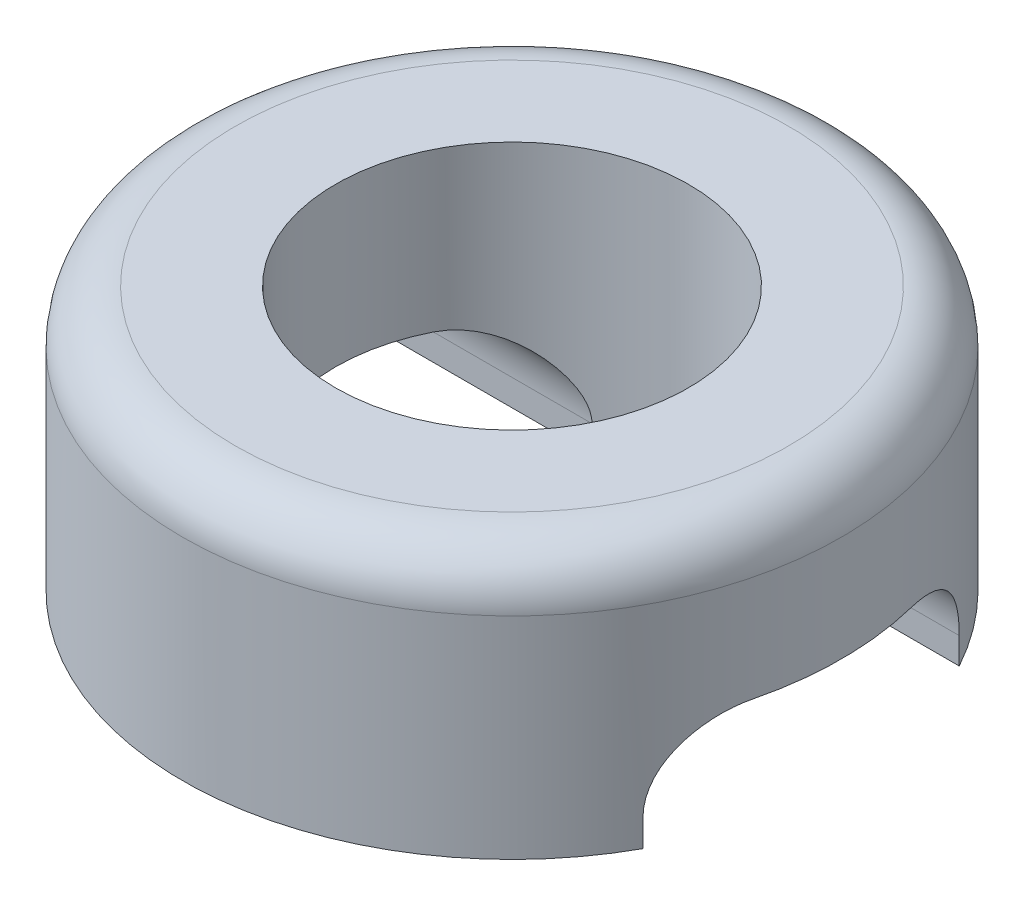
ISO-10303-21;
HEADER;
FILE_DESCRIPTION(('STEP AP214'),'2;1');
FILE_NAME('part.step','',(''),(''),'','','');
FILE_SCHEMA(('AUTOMOTIVE_DESIGN { 1 0 10303 214 1 1 1 1 }'));
ENDSEC;
DATA;
#1=APPLICATION_CONTEXT('core data for automotive mechanical design processes');
#2=APPLICATION_PROTOCOL_DEFINITION('international standard','automotive_design',2000,#1);
#3=PRODUCT_CONTEXT('',#1,'mechanical');
#4=PRODUCT('Part','Part','',(#3));
#5=PRODUCT_RELATED_PRODUCT_CATEGORY('part','',(#4));
#6=PRODUCT_DEFINITION_FORMATION('','',#4);
#7=PRODUCT_DEFINITION_CONTEXT('part definition',#1,'design');
#8=PRODUCT_DEFINITION('design','',#6,#7);
#9=PRODUCT_DEFINITION_SHAPE('','',#8);
#10=(LENGTH_UNIT() NAMED_UNIT(*) SI_UNIT(.MILLI.,.METRE.));
#11=(NAMED_UNIT(*) PLANE_ANGLE_UNIT() SI_UNIT($,.RADIAN.));
#12=(NAMED_UNIT(*) SI_UNIT($,.STERADIAN.) SOLID_ANGLE_UNIT());
#13=UNCERTAINTY_MEASURE_WITH_UNIT(LENGTH_MEASURE(1.E-05),#10,'distance_accuracy_value','');
#14=(GEOMETRIC_REPRESENTATION_CONTEXT(3) GLOBAL_UNCERTAINTY_ASSIGNED_CONTEXT((#13)) GLOBAL_UNIT_ASSIGNED_CONTEXT((#10,
#11,#12)) REPRESENTATION_CONTEXT('',''));
#15=CARTESIAN_POINT('',(0.,0.,0.));
#16=DIRECTION('',(0.,0.,1.));
#17=DIRECTION('',(1.,0.,0.));
#18=AXIS2_PLACEMENT_3D('',#15,#16,#17);
#19=CARTESIAN_POINT('',(0.,0.,0.));
#20=DIRECTION('',(0.,1.,0.));
#21=DIRECTION('',(0.,0.,1.));
#22=AXIS2_PLACEMENT_3D('',#19,#20,#21);
#23=PLANE('',#22);
#24=CARTESIAN_POINT('',(0.,0.,0.));
#25=DIRECTION('',(0.,1.,0.));
#26=DIRECTION('',(0.,0.,1.));
#27=AXIS2_PLACEMENT_3D('',#24,#25,#26);
#28=CIRCLE('',#27,7.9375);
#29=CARTESIAN_POINT('',(-6.96331862332897,0.,3.81));
#30=VERTEX_POINT('',#29);
#31=CARTESIAN_POINT('',(6.96331862332897,0.,3.81));
#32=VERTEX_POINT('',#31);
#33=EDGE_CURVE('E152',#30,#32,#28,.T.);
#34=ORIENTED_EDGE('',*,*,#33,.F.);
#35=DIRECTION('',(1.,0.,0.));
#36=VECTOR('',#35,1.);
#37=CARTESIAN_POINT('',(-7.9375,0.,3.81));
#38=LINE('',#37,#36);
#39=CARTESIAN_POINT('',(-1.88318878501334,0.,3.81));
#40=VERTEX_POINT('',#39);
#41=EDGE_CURVE('E278',#30,#40,#38,.T.);
#42=ORIENTED_EDGE('',*,*,#41,.T.);
#43=CARTESIAN_POINT('',(0.,0.,0.));
#44=DIRECTION('',(0.,1.,0.));
#45=DIRECTION('',(0.,0.,1.));
#46=AXIS2_PLACEMENT_3D('',#43,#44,#45);
#47=CIRCLE('',#46,4.25);
#48=CARTESIAN_POINT('',(1.88318878501334,0.,3.81));
#49=VERTEX_POINT('',#48);
#50=EDGE_CURVE('E158',#40,#49,#47,.T.);
#51=ORIENTED_EDGE('',*,*,#50,.T.);
#52=EDGE_CURVE('E280',#49,#32,#38,.T.);
#53=ORIENTED_EDGE('',*,*,#52,.T.);
#54=EDGE_LOOP('',(#34,#42,#51,#53));
#55=FACE_BOUND('',#54,.T.);
#56=ADVANCED_FACE('F35',(#55),#23,.F.);
#57=CARTESIAN_POINT('',(0.,6.35,0.));
#58=DIRECTION('',(0.,1.,0.));
#59=DIRECTION('',(0.,0.,1.));
#60=AXIS2_PLACEMENT_3D('',#57,#58,#59);
#61=PLANE('',#60);
#62=CARTESIAN_POINT('',(0.,6.35,0.));
#63=DIRECTION('',(0.,1.,0.));
#64=DIRECTION('',(0.,0.,1.));
#65=AXIS2_PLACEMENT_3D('',#62,#63,#64);
#66=CIRCLE('',#65,6.6675);
#67=CARTESIAN_POINT('',(0.,6.35,6.6675));
#68=VERTEX_POINT('',#67);
#69=EDGE_CURVE('E43',#68,#68,#66,.T.);
#70=ORIENTED_EDGE('',*,*,#69,.T.);
#71=EDGE_LOOP('',(#70));
#72=FACE_BOUND('',#71,.T.);
#73=CARTESIAN_POINT('',(0.,6.35,0.));
#74=DIRECTION('',(0.,1.,0.));
#75=DIRECTION('',(0.,0.,1.));
#76=AXIS2_PLACEMENT_3D('',#73,#74,#75);
#77=CIRCLE('',#76,4.25);
#78=CARTESIAN_POINT('',(0.,6.35,4.25));
#79=VERTEX_POINT('',#78);
#80=EDGE_CURVE('E156',#79,#79,#77,.T.);
#81=ORIENTED_EDGE('',*,*,#80,.F.);
#82=EDGE_LOOP('',(#81));
#83=FACE_BOUND('',#82,.T.);
#84=ADVANCED_FACE('F258',(#72,#83),#61,.T.);
#85=CARTESIAN_POINT('',(6.96331862332897,0.,-3.81));
#86=VERTEX_POINT('',#85);
#87=CARTESIAN_POINT('',(-6.96331862332897,0.,-3.81));
#88=VERTEX_POINT('',#87);
#89=EDGE_CURVE('E142',#86,#88,#28,.T.);
#90=ORIENTED_EDGE('',*,*,#89,.F.);
#91=DIRECTION('',(1.,0.,0.));
#92=VECTOR('',#91,1.);
#93=CARTESIAN_POINT('',(-7.9375,0.,-3.81));
#94=LINE('',#93,#92);
#95=CARTESIAN_POINT('',(1.88318878501334,0.,-3.81));
#96=VERTEX_POINT('',#95);
#97=EDGE_CURVE('E145',#96,#86,#94,.T.);
#98=ORIENTED_EDGE('',*,*,#97,.F.);
#99=CARTESIAN_POINT('',(-1.88318878501334,0.,-3.81));
#100=VERTEX_POINT('',#99);
#101=EDGE_CURVE('E144',#96,#100,#47,.T.);
#102=ORIENTED_EDGE('',*,*,#101,.T.);
#103=EDGE_CURVE('E129',#88,#100,#94,.T.);
#104=ORIENTED_EDGE('',*,*,#103,.F.);
#105=EDGE_LOOP('',(#90,#98,#102,#104));
#106=FACE_BOUND('',#105,.T.);
#107=ADVANCED_FACE('F140',(#106),#23,.F.);
#108=CARTESIAN_POINT('',(0.,6.35,0.));
#109=DIRECTION('',(0.,-1.,0.));
#110=DIRECTION('',(0.,0.,-1.));
#111=AXIS2_PLACEMENT_3D('',#108,#109,#110);
#112=CYLINDRICAL_SURFACE('',#111,7.9375);
#113=CARTESIAN_POINT('',(0.,5.08,0.));
#114=DIRECTION('',(0.,1.,0.));
#115=DIRECTION('',(0.,0.,1.));
#116=AXIS2_PLACEMENT_3D('',#113,#114,#115);
#117=CIRCLE('',#116,7.9375);
#118=CARTESIAN_POINT('',(0.,5.08,7.9375));
#119=VERTEX_POINT('',#118);
#120=EDGE_CURVE('E11',#119,#119,#117,.F.);
#121=ORIENTED_EDGE('',*,*,#120,.T.);
#122=EDGE_LOOP('',(#121));
#123=FACE_BOUND('',#122,.T.);
#124=ORIENTED_EDGE('',*,*,#33,.T.);
#125=DIRECTION('',(0.,-1.,0.));
#126=VECTOR('',#125,1.);
#127=CARTESIAN_POINT('',(6.96331862332897,6.35,3.81));
#128=LINE('',#127,#126);
#129=CARTESIAN_POINT('',(6.96331862332897,0.635,3.81));
#130=VERTEX_POINT('',#129);
#131=EDGE_CURVE('E282',#32,#130,#128,.F.);
#132=ORIENTED_EDGE('',*,*,#131,.T.);
#133=CARTESIAN_POINT('',(6.96331862332897,0.635,3.81));
#134=CARTESIAN_POINT('',(6.96330971734871,0.684571337621361,3.8100083999307));
#135=CARTESIAN_POINT('',(6.96437707471063,0.734136683480784,3.8080653495333));
#136=CARTESIAN_POINT('',(6.96859712753622,0.83285719490267,3.80034150649958));
#137=CARTESIAN_POINT('',(6.97174891950333,0.882012528840981,3.79456237660491));
#138=CARTESIAN_POINT('',(6.98005087105731,0.979325280765483,3.77926807086319));
#139=CARTESIAN_POINT('',(6.98519140635103,1.02748634569067,3.76977088551387));
#140=CARTESIAN_POINT('',(6.99734438606697,1.12270109807122,3.74716451509793));
#141=CARTESIAN_POINT('',(7.00435696004143,1.16975470864117,3.73405508004777));
#142=CARTESIAN_POINT('',(7.02796000436399,1.30865266000526,3.68955565232242));
#143=CARTESIAN_POINT('',(7.04713557627256,1.39845407178734,3.65295924328777));
#144=CARTESIAN_POINT('',(7.09088746940067,1.57046709469664,3.56728516619077));
#145=CARTESIAN_POINT('',(7.11546968308542,1.65267028493978,3.51819387124215));
#146=CARTESIAN_POINT('',(7.17011544831952,1.81300152221234,3.40551152098712));
#147=CARTESIAN_POINT('',(7.20042880327215,1.89053401138598,3.34119466138171));
#148=CARTESIAN_POINT('',(7.26349231070216,2.03406772974483,3.20178715463066));
#149=CARTESIAN_POINT('',(7.29624357611327,2.10006364574892,3.12669157217464));
#150=CARTESIAN_POINT('',(7.36590090773889,2.22556095105073,2.95912959654468));
#151=CARTESIAN_POINT('',(7.40288800706839,2.28369750000547,2.86567110440167));
#152=CARTESIAN_POINT('',(7.47574256606658,2.38316606975702,2.66984849917663));
#153=CARTESIAN_POINT('',(7.5116105832171,2.42450658516905,2.56748891971217));
#154=CARTESIAN_POINT('',(7.57519856041543,2.48408822819273,2.37256400229565));
#155=CARTESIAN_POINT('',(7.60332332606109,2.50490389467853,2.28091302499706));
#156=CARTESIAN_POINT('',(7.6567453835679,2.53287925359981,2.0946930168271));
#157=CARTESIAN_POINT('',(7.6820408210699,2.54003003879286,2.00012212343029));
#158=CARTESIAN_POINT('',(7.70550979818986,2.54,1.905));
#159=B_SPLINE_CURVE_WITH_KNOTS('',3,(#133,#134,#135,#136,#137,#138,#139,#140,#141,#142,#143,
#144,#145,#146,#147,#148,#149,#150,#151,#152,#153,#154,#155,#156,#157,#158),.UNSPECIFIED.,.F.,
.F.,(4,2,2,2,2,2,2,2,2,2,2,2,4),(0.,0.148654528629517,0.297244665263553,0.445124535000367,
0.593014641244911,0.888132433579724,1.18357347003446,1.49788312274621,1.81233715189798,
2.1591134301795,2.50571410694372,2.79901628553772,3.09250958351312),.UNSPECIFIED.);
#160=CARTESIAN_POINT('',(7.70550979818986,2.54,1.905));
#161=VERTEX_POINT('',#160);
#162=EDGE_CURVE('E233',#130,#161,#159,.T.);
#163=ORIENTED_EDGE('',*,*,#162,.T.);
#164=CARTESIAN_POINT('',(0.,2.54,0.));
#165=DIRECTION('',(0.,1.,0.));
#166=DIRECTION('',(0.,0.,1.));
#167=AXIS2_PLACEMENT_3D('',#164,#165,#166);
#168=CIRCLE('',#167,7.9375);
#169=CARTESIAN_POINT('',(7.70550979818986,2.54,-1.905));
#170=VERTEX_POINT('',#169);
#171=EDGE_CURVE('E292',#161,#170,#168,.T.);
#172=ORIENTED_EDGE('',*,*,#171,.T.);
#173=CARTESIAN_POINT('',(7.70550979818986,2.54,-1.905));
#174=CARTESIAN_POINT('',(7.69168912501219,2.53999973121714,-1.96091803105047));
#175=CARTESIAN_POINT('',(7.67726031554106,2.53753694694524,-2.01665054421886));
#176=CARTESIAN_POINT('',(7.64731669586853,2.52779249692022,-2.12737701700698));
#177=CARTESIAN_POINT('',(7.6318022858931,2.52051259879874,-2.18237123999136));
#178=CARTESIAN_POINT('',(7.58391087865882,2.49166435254407,-2.34541359404266));
#179=CARTESIAN_POINT('',(7.55009697402387,2.46308603071164,-2.4518783118832));
#180=CARTESIAN_POINT('',(7.48020559819006,2.38849822452339,-2.6574885301585));
#181=CARTESIAN_POINT('',(7.4441304183731,2.34250615490643,-2.75664122505883));
#182=CARTESIAN_POINT('',(7.37140432478056,2.23438408451349,-2.94560002615675));
#183=CARTESIAN_POINT('',(7.33475300728835,2.17224224594768,-3.0353992083047));
#184=CARTESIAN_POINT('',(7.2617075622229,2.03082589075286,-3.2063132131265));
#185=CARTESIAN_POINT('',(7.22536467022754,1.95104012585804,-3.28702830257871));
#186=CARTESIAN_POINT('',(7.15680743082065,1.77731653258336,-3.43374179137968));
#187=CARTESIAN_POINT('',(7.12459308573784,1.683378696221,-3.49974018242743));
#188=CARTESIAN_POINT('',(7.0681020828453,1.48708354494609,-3.61243479489868));
#189=CARTESIAN_POINT('',(7.04358449041438,1.38514282569587,-3.65973240890417));
#190=CARTESIAN_POINT('',(7.00349551239241,1.17305071693939,-3.73588576787916));
#191=CARTESIAN_POINT('',(6.98790237579539,1.0629200357042,-3.76478637018952));
#192=CARTESIAN_POINT('',(6.97292621634711,0.898726630389736,-3.79239920352652));
#193=CARTESIAN_POINT('',(6.96933445786319,0.846256424161746,-3.79898931205036));
#194=CARTESIAN_POINT('',(6.96452852048648,0.740869497898738,-3.80778973771252));
#195=CARTESIAN_POINT('',(6.96331313789491,0.687953017562957,-3.81000227221742));
#196=CARTESIAN_POINT('',(6.96331862332897,0.635000000000001,-3.81));
#197=B_SPLINE_CURVE_WITH_KNOTS('',3,(#173,#174,#175,#176,#177,#178,#179,#180,#181,#182,#183,
#184,#185,#186,#187,#188,#189,#190,#191,#192,#193,#194,#195,#196),.UNSPECIFIED.,.F.,.F.,(4,2,2,
2,2,2,2,2,2,2,2,4),(0.,0.172682169402191,0.345301008493322,0.689449970084579,1.03325566830264,
1.37731409058996,1.73308578148972,2.0888576730637,2.43201572333951,2.77433381530749,
2.93314269462705,3.09187111208691),.UNSPECIFIED.);
#198=CARTESIAN_POINT('',(6.96331862332897,0.635000000000001,-3.81));
#199=VERTEX_POINT('',#198);
#200=EDGE_CURVE('E189',#170,#199,#197,.T.);
#201=ORIENTED_EDGE('',*,*,#200,.T.);
#202=DIRECTION('',(0.,-1.,0.));
#203=VECTOR('',#202,1.);
#204=CARTESIAN_POINT('',(6.96331862332897,6.35,-3.81));
#205=LINE('',#204,#203);
#206=EDGE_CURVE('E135',#199,#86,#205,.T.);
#207=ORIENTED_EDGE('',*,*,#206,.T.);
#208=ORIENTED_EDGE('',*,*,#89,.T.);
#209=DIRECTION('',(0.,-1.,0.));
#210=VECTOR('',#209,1.);
#211=CARTESIAN_POINT('',(-6.96331862332897,6.35,-3.81));
#212=LINE('',#211,#210);
#213=CARTESIAN_POINT('',(-6.96331862332897,0.635000000000001,-3.81));
#214=VERTEX_POINT('',#213);
#215=EDGE_CURVE('E125',#88,#214,#212,.F.);
#216=ORIENTED_EDGE('',*,*,#215,.T.);
#217=CARTESIAN_POINT('',(-6.96331862332897,0.635000000000001,-3.81));
#218=CARTESIAN_POINT('',(-6.96330971734871,0.684571337621362,-3.8100083999307));
#219=CARTESIAN_POINT('',(-6.96437707471063,0.734136683480785,-3.8080653495333));
#220=CARTESIAN_POINT('',(-6.96859712753622,0.832857194902671,-3.80034150649958));
#221=CARTESIAN_POINT('',(-6.97174891950333,0.882012528840982,-3.79456237660491));
#222=CARTESIAN_POINT('',(-6.98005087105731,0.979325280765484,-3.77926807086319));
#223=CARTESIAN_POINT('',(-6.98519140635103,1.02748634569067,-3.76977088551387));
#224=CARTESIAN_POINT('',(-6.99734438606697,1.12270109807122,-3.74716451509793));
#225=CARTESIAN_POINT('',(-7.00435696004143,1.16975470864117,-3.73405508004777));
#226=CARTESIAN_POINT('',(-7.02796000436399,1.30865266000526,-3.68955565232242));
#227=CARTESIAN_POINT('',(-7.04713557627256,1.39845407178734,-3.65295924328777));
#228=CARTESIAN_POINT('',(-7.09088746940067,1.57046709469664,-3.56728516619077));
#229=CARTESIAN_POINT('',(-7.11546968308543,1.65267028493978,-3.51819387124215));
#230=CARTESIAN_POINT('',(-7.17011544831952,1.81300152221234,-3.40551152098712));
#231=CARTESIAN_POINT('',(-7.20042880327215,1.89053401138599,-3.34119466138171));
#232=CARTESIAN_POINT('',(-7.26349231070216,2.03406772974483,-3.20178715463066));
#233=CARTESIAN_POINT('',(-7.29624357611327,2.10006364574892,-3.12669157217464));
#234=CARTESIAN_POINT('',(-7.36590090773889,2.22556095105073,-2.95912959654468));
#235=CARTESIAN_POINT('',(-7.40288800706838,2.28369750000547,-2.86567110440167));
#236=CARTESIAN_POINT('',(-7.47574256606658,2.38316606975702,-2.66984849917663));
#237=CARTESIAN_POINT('',(-7.5116105832171,2.42450658516905,-2.56748891971217));
#238=CARTESIAN_POINT('',(-7.57519856041543,2.48408822819273,-2.37256400229565));
#239=CARTESIAN_POINT('',(-7.60332332606109,2.50490389467853,-2.28091302499706));
#240=CARTESIAN_POINT('',(-7.6567453835679,2.53287925359981,-2.09469301682709));
#241=CARTESIAN_POINT('',(-7.6820408210699,2.54003003879286,-2.00012212343028));
#242=CARTESIAN_POINT('',(-7.70550979818986,2.54,-1.905));
#243=B_SPLINE_CURVE_WITH_KNOTS('',3,(#217,#218,#219,#220,#221,#222,#223,#224,#225,#226,#227,
#228,#229,#230,#231,#232,#233,#234,#235,#236,#237,#238,#239,#240,#241,#242),.UNSPECIFIED.,.F.,
.F.,(4,2,2,2,2,2,2,2,2,2,2,2,4),(0.,0.148654528629517,0.297244665263552,0.445124535000367,
0.593014641244911,0.888132433579724,1.18357347003446,1.49788312274621,1.81233715189798,
2.1591134301795,2.50571410694372,2.79901628553773,3.09250958351312),.UNSPECIFIED.);
#244=CARTESIAN_POINT('',(-7.70550979818986,2.54,-1.905));
#245=VERTEX_POINT('',#244);
#246=EDGE_CURVE('E227',#214,#245,#243,.T.);
#247=ORIENTED_EDGE('',*,*,#246,.T.);
#248=CARTESIAN_POINT('',(-7.70550979818986,2.54,1.905));
#249=VERTEX_POINT('',#248);
#250=EDGE_CURVE('E290',#245,#249,#168,.T.);
#251=ORIENTED_EDGE('',*,*,#250,.T.);
#252=CARTESIAN_POINT('',(-7.70550979818986,2.54,1.905));
#253=CARTESIAN_POINT('',(-7.69168912501219,2.53999973121714,1.96091803105047));
#254=CARTESIAN_POINT('',(-7.67726031554106,2.53753694694524,2.01665054421886));
#255=CARTESIAN_POINT('',(-7.64731669586853,2.52779249692022,2.12737701700698));
#256=CARTESIAN_POINT('',(-7.6318022858931,2.52051259879874,2.18237123999137));
#257=CARTESIAN_POINT('',(-7.58391087865882,2.49166435254407,2.34541359404266));
#258=CARTESIAN_POINT('',(-7.55009697402387,2.46308603071164,2.4518783118832));
#259=CARTESIAN_POINT('',(-7.48020559819006,2.38849822452339,2.6574885301585));
#260=CARTESIAN_POINT('',(-7.4441304183731,2.34250615490643,2.75664122505883));
#261=CARTESIAN_POINT('',(-7.37140432478056,2.23438408451349,2.94560002615675));
#262=CARTESIAN_POINT('',(-7.33475300728835,2.17224224594768,3.0353992083047));
#263=CARTESIAN_POINT('',(-7.2617075622229,2.03082589075285,3.2063132131265));
#264=CARTESIAN_POINT('',(-7.22536467022754,1.95104012585804,3.28702830257871));
#265=CARTESIAN_POINT('',(-7.15680743082065,1.77731653258336,3.43374179137968));
#266=CARTESIAN_POINT('',(-7.12459308573784,1.68337869622099,3.49974018242743));
#267=CARTESIAN_POINT('',(-7.0681020828453,1.48708354494609,3.61243479489868));
#268=CARTESIAN_POINT('',(-7.04358449041438,1.38514282569587,3.65973240890417));
#269=CARTESIAN_POINT('',(-7.00349551239241,1.17305071693939,3.73588576787917));
#270=CARTESIAN_POINT('',(-6.98790237579539,1.06292003570419,3.76478637018952));
#271=CARTESIAN_POINT('',(-6.97292621634711,0.898726630389732,3.79239920352652));
#272=CARTESIAN_POINT('',(-6.9693344578632,0.846256424161744,3.79898931205036));
#273=CARTESIAN_POINT('',(-6.96452852048648,0.740869497898736,3.80778973771252));
#274=CARTESIAN_POINT('',(-6.96331313789491,0.687953017562956,3.81000227221742));
#275=CARTESIAN_POINT('',(-6.96331862332897,0.635,3.81));
#276=B_SPLINE_CURVE_WITH_KNOTS('',3,(#252,#253,#254,#255,#256,#257,#258,#259,#260,#261,#262,
#263,#264,#265,#266,#267,#268,#269,#270,#271,#272,#273,#274,#275),.UNSPECIFIED.,.F.,.F.,(4,2,2,
2,2,2,2,2,2,2,2,4),(0.,0.172682169402191,0.345301008493322,0.68944997008458,1.03325566830264,
1.37731409058997,1.73308578148972,2.0888576730637,2.43201572333951,2.77433381530749,
2.93314269462705,3.09187111208691),.UNSPECIFIED.);
#277=CARTESIAN_POINT('',(-6.96331862332897,0.635,3.81));
#278=VERTEX_POINT('',#277);
#279=EDGE_CURVE('E50',#249,#278,#276,.T.);
#280=ORIENTED_EDGE('',*,*,#279,.T.);
#281=DIRECTION('',(0.,-1.,0.));
#282=VECTOR('',#281,1.);
#283=CARTESIAN_POINT('',(-6.96331862332897,6.35,3.81));
#284=LINE('',#283,#282);
#285=EDGE_CURVE('E283',#278,#30,#284,.T.);
#286=ORIENTED_EDGE('',*,*,#285,.T.);
#287=EDGE_LOOP('',(#124,#132,#163,#172,#201,#207,#208,#216,#247,#251,#280,#286));
#288=FACE_BOUND('',#287,.T.);
#289=ADVANCED_FACE('F148',(#123,#288),#112,.T.);
#290=CARTESIAN_POINT('',(0.,6.35,0.));
#291=DIRECTION('',(0.,-1.,0.));
#292=DIRECTION('',(0.,0.,-1.));
#293=AXIS2_PLACEMENT_3D('',#290,#291,#292);
#294=CYLINDRICAL_SURFACE('',#293,4.25);
#295=DIRECTION('',(0.,-1.,0.));
#296=VECTOR('',#295,1.);
#297=CARTESIAN_POINT('',(1.88318878501333,6.35,3.81));
#298=LINE('',#297,#296);
#299=CARTESIAN_POINT('',(1.88318878501333,0.635,3.81));
#300=VERTEX_POINT('',#299);
#301=EDGE_CURVE('E168',#49,#300,#298,.F.);
#302=ORIENTED_EDGE('',*,*,#301,.F.);
#303=ORIENTED_EDGE('',*,*,#50,.F.);
#304=DIRECTION('',(0.,-1.,0.));
#305=VECTOR('',#304,1.);
#306=CARTESIAN_POINT('',(-1.88318878501333,6.35,3.81));
#307=LINE('',#306,#305);
#308=CARTESIAN_POINT('',(-1.88318878501333,0.635,3.81));
#309=VERTEX_POINT('',#308);
#310=EDGE_CURVE('E163',#309,#40,#307,.T.);
#311=ORIENTED_EDGE('',*,*,#310,.F.);
#312=CARTESIAN_POINT('',(-1.88318878501333,0.635,3.81));
#313=CARTESIAN_POINT('',(-1.88317476029156,0.662567093604433,3.81000452436866));
#314=CARTESIAN_POINT('',(-1.8844003937791,0.690115344067366,3.80940129105042));
#315=CARTESIAN_POINT('',(-1.88920224135121,0.744905991710838,3.80702327472782));
#316=CARTESIAN_POINT('',(-1.89277414517683,0.772148856746206,3.80525063996816));
#317=CARTESIAN_POINT('',(-1.90666953936387,0.85228002412367,3.79831794529634));
#318=CARTESIAN_POINT('',(-1.92018176045948,0.904492016389014,3.79153981795543));
#319=CARTESIAN_POINT('',(-1.96010861535903,1.02446566721352,3.77109103818362));
#320=CARTESIAN_POINT('',(-1.98943318321977,1.09094166260044,3.75580716983146));
#321=CARTESIAN_POINT('',(-2.05623285507061,1.21851119877516,3.71965845976476));
#322=CARTESIAN_POINT('',(-2.09377386363189,1.27955525255753,3.69874815750897));
#323=CARTESIAN_POINT('',(-2.17038088401404,1.39154868551199,3.65427826974005));
#324=CARTESIAN_POINT('',(-2.20906074980755,1.44291538454116,3.63108337585271));
#325=CARTESIAN_POINT('',(-2.28900969722803,1.54184751480844,3.5812229318275));
#326=CARTESIAN_POINT('',(-2.33028089494073,1.58940976533009,3.55455452560998));
#327=CARTESIAN_POINT('',(-2.41435346611465,1.68108447049508,3.49799428879572));
#328=CARTESIAN_POINT('',(-2.45715422523131,1.72519828799721,3.46810374284913));
#329=CARTESIAN_POINT('',(-2.54361632548259,1.81025416766795,3.40519924094641));
#330=CARTESIAN_POINT('',(-2.58727799505542,1.85119498877309,3.37218407395057));
#331=CARTESIAN_POINT('',(-2.72724313571921,1.97711388645086,3.26183876360463));
#332=CARTESIAN_POINT('',(-2.82420225778284,2.05635464726581,3.17863272649775));
#333=CARTESIAN_POINT('',(-3.01561428551168,2.19974273450408,2.99765602353507));
#334=CARTESIAN_POINT('',(-3.11006798922045,2.26389491953738,2.89989006266696));
#335=CARTESIAN_POINT('',(-3.28565908241188,2.37017282786103,2.69875322184743));
#336=CARTESIAN_POINT('',(-3.36725117697591,2.41368411476183,2.59651973974844));
#337=CARTESIAN_POINT('',(-3.52286106802457,2.48300105492804,2.38106540952137));
#338=CARTESIAN_POINT('',(-3.59690115706119,2.50886018228029,2.26787894178375));
#339=CARTESIAN_POINT('',(-3.68926416545163,2.52931963113057,2.11045069973923));
#340=CARTESIAN_POINT('',(-3.71213668259858,2.53328844418579,2.06995557315924));
#341=CARTESIAN_POINT('',(-3.75661239735193,2.53862819642558,1.98809656777328));
#342=CARTESIAN_POINT('',(-3.77821532939592,2.53999859395379,1.94673250964954));
#343=CARTESIAN_POINT('',(-3.799141350358,2.54,1.905));
#344=B_SPLINE_CURVE_WITH_KNOTS('',3,(#312,#313,#314,#315,#316,#317,#318,#319,#320,#321,#322,
#323,#324,#325,#326,#327,#328,#329,#330,#331,#332,#333,#334,#335,#336,#337,#338,#339,#340,#341,
#342,#343),.UNSPECIFIED.,.F.,.F.,(4,2,2,2,2,2,2,2,2,2,2,2,2,2,2,4),(0.,0.0826342654434423,
0.165117149059795,0.327363861985154,0.548869062095374,0.772220713185919,0.977006817343896,
1.18196238167182,1.38683653142284,1.59179041398028,2.04127253413618,2.49060971964725,
2.90267909403684,3.31349457081487,3.45344718976722,3.59342897953305),.UNSPECIFIED.);
#345=CARTESIAN_POINT('',(-3.799141350358,2.54,1.905));
#346=VERTEX_POINT('',#345);
#347=EDGE_CURVE('E58',#309,#346,#344,.T.);
#348=ORIENTED_EDGE('',*,*,#347,.T.);
#349=CARTESIAN_POINT('',(0.,2.54,0.));
#350=DIRECTION('',(0.,1.,0.));
#351=DIRECTION('',(0.,0.,1.));
#352=AXIS2_PLACEMENT_3D('',#349,#350,#351);
#353=CIRCLE('',#352,4.25);
#354=CARTESIAN_POINT('',(-3.799141350358,2.54,-1.905));
#355=VERTEX_POINT('',#354);
#356=EDGE_CURVE('E154',#355,#346,#353,.T.);
#357=ORIENTED_EDGE('',*,*,#356,.F.);
#358=CARTESIAN_POINT('',(-3.799141350358,2.54,-1.905));
#359=CARTESIAN_POINT('',(-3.76872739423826,2.54000236802613,-1.96568398404324));
#360=CARTESIAN_POINT('',(-3.73685561336468,2.5371014880177,-2.0255893279937));
#361=CARTESIAN_POINT('',(-3.6705669520293,2.52595262291597,-2.14335430724086));
#362=CARTESIAN_POINT('',(-3.63615384594497,2.51771243168466,-2.201216794907));
#363=CARTESIAN_POINT('',(-3.56540329017807,2.49644411595052,-2.31404345248077));
#364=CARTESIAN_POINT('',(-3.52908744504402,2.48346263720856,-2.36903008549757));
#365=CARTESIAN_POINT('',(-3.45455664217295,2.45312608678563,-2.47645392264822));
#366=CARTESIAN_POINT('',(-3.4163408151005,2.43576899798436,-2.52888993763192));
#367=CARTESIAN_POINT('',(-3.28130645115088,2.36880318554407,-2.70563234832592));
#368=CARTESIAN_POINT('',(-3.18034075695827,2.30908873248685,-2.82317058005983));
#369=CARTESIAN_POINT('',(-3.02489371766011,2.20469089277506,-2.98634709601204));
#370=CARTESIAN_POINT('',(-2.97221230902952,2.16725680480312,-3.03871731024128));
#371=CARTESIAN_POINT('',(-2.86611567707781,2.08772497749553,-3.13897856656692));
#372=CARTESIAN_POINT('',(-2.81270079928842,2.04562937231576,-3.18687164003747));
#373=CARTESIAN_POINT('',(-2.70489878837193,1.9562238449609,-3.27889175317605));
#374=CARTESIAN_POINT('',(-2.65050996328635,1.90884029430136,-3.32294493183253));
#375=CARTESIAN_POINT('',(-2.5423821482008,1.80934617952997,-3.40638427057551));
#376=CARTESIAN_POINT('',(-2.48864357356555,1.75723275787047,-3.44576757577897));
#377=CARTESIAN_POINT('',(-2.38320714454026,1.64826086349911,-3.51950849201463));
#378=CARTESIAN_POINT('',(-2.33150043263963,1.59142740967894,-3.55389023884373));
#379=CARTESIAN_POINT('',(-2.23151707332343,1.47221135972676,-3.61750232409257));
#380=CARTESIAN_POINT('',(-2.18323522645153,1.40983751370844,-3.64674057551961));
#381=CARTESIAN_POINT('',(-2.10261731109582,1.29283702634766,-3.69366779707677));
#382=CARTESIAN_POINT('',(-2.0691005178582,1.23948920590548,-3.71248477801589));
#383=CARTESIAN_POINT('',(-2.00789265793777,1.1282738393949,-3.74594177647678));
#384=CARTESIAN_POINT('',(-1.98019460773838,1.07041182691622,-3.76058680867868));
#385=CARTESIAN_POINT('',(-1.93810422050968,0.961754007093295,-3.78242042435483));
#386=CARTESIAN_POINT('',(-1.92217596516897,0.911747627832123,-3.79050234160073));
#387=CARTESIAN_POINT('',(-1.89797762808324,0.80950329074191,-3.80268055002386));
#388=CARTESIAN_POINT('',(-1.88968313926344,0.75727300765367,-3.80678954577798));
#389=CARTESIAN_POINT('',(-1.88403931764754,0.681503007536526,-3.80957824008196));
#390=CARTESIAN_POINT('',(-1.88316327789127,0.658250412361222,-3.81000905004648));
#391=CARTESIAN_POINT('',(-1.88318878501429,0.634999999999931,-3.81000000000001));
#392=B_SPLINE_CURVE_WITH_KNOTS('',3,(#358,#359,#360,#361,#362,#363,#364,#365,#366,#367,#368,
#369,#370,#371,#372,#373,#374,#375,#376,#377,#378,#379,#380,#381,#382,#383,#384,#385,#386,#387,
#388,#389,#390,#391),.UNSPECIFIED.,.F.,.F.,(4,2,2,2,2,2,2,2,2,2,2,2,2,2,2,2,4),(0.,
0.203491782786761,0.406687193108681,0.607935124319233,0.809275999368396,1.30439182258937,
1.55377349715735,1.80304146711385,2.05636080013024,2.30983420769394,2.56204069100188,
2.81385570800736,3.0107303164625,3.20736727349817,3.36608031090813,3.52428412178559,
3.59402975928783),.UNSPECIFIED.);
#393=CARTESIAN_POINT('',(-1.88318878501333,0.635000000000001,-3.81));
#394=VERTEX_POINT('',#393);
#395=EDGE_CURVE('E221',#355,#394,#392,.T.);
#396=ORIENTED_EDGE('',*,*,#395,.T.);
#397=DIRECTION('',(0.,-1.,0.));
#398=VECTOR('',#397,1.);
#399=CARTESIAN_POINT('',(-1.88318878501333,6.35,-3.81));
#400=LINE('',#399,#398);
#401=EDGE_CURVE('E151',#100,#394,#400,.F.);
#402=ORIENTED_EDGE('',*,*,#401,.F.);
#403=ORIENTED_EDGE('',*,*,#101,.F.);
#404=DIRECTION('',(0.,-1.,0.));
#405=VECTOR('',#404,1.);
#406=CARTESIAN_POINT('',(1.88318878501333,6.35,-3.81));
#407=LINE('',#406,#405);
#408=CARTESIAN_POINT('',(1.88318878501333,0.635000000000001,-3.81));
#409=VERTEX_POINT('',#408);
#410=EDGE_CURVE('E166',#409,#96,#407,.T.);
#411=ORIENTED_EDGE('',*,*,#410,.F.);
#412=CARTESIAN_POINT('',(1.88318878501333,0.635000000000001,-3.81));
#413=CARTESIAN_POINT('',(1.88317476029156,0.662567093604434,-3.81000452436866));
#414=CARTESIAN_POINT('',(1.8844003937791,0.690115344067367,-3.80940129105042));
#415=CARTESIAN_POINT('',(1.88920224135121,0.744905991710839,-3.80702327472782));
#416=CARTESIAN_POINT('',(1.89277414517683,0.772148856746207,-3.80525063996816));
#417=CARTESIAN_POINT('',(1.90666953936386,0.852280024123671,-3.79831794529634));
#418=CARTESIAN_POINT('',(1.92018176045948,0.904492016389015,-3.79153981795543));
#419=CARTESIAN_POINT('',(1.96010861535903,1.02446566721352,-3.77109103818362));
#420=CARTESIAN_POINT('',(1.98943318321977,1.09094166260044,-3.75580716983146));
#421=CARTESIAN_POINT('',(2.05623285507061,1.21851119877516,-3.71965845976476));
#422=CARTESIAN_POINT('',(2.09377386363189,1.27955525255753,-3.69874815750897));
#423=CARTESIAN_POINT('',(2.17038088401404,1.39154868551199,-3.65427826974005));
#424=CARTESIAN_POINT('',(2.20906074980755,1.44291538454116,-3.63108337585271));
#425=CARTESIAN_POINT('',(2.28900969722803,1.54184751480844,-3.5812229318275));
#426=CARTESIAN_POINT('',(2.33028089494073,1.58940976533009,-3.55455452560998));
#427=CARTESIAN_POINT('',(2.41435346611465,1.68108447049508,-3.49799428879572));
#428=CARTESIAN_POINT('',(2.45715422523131,1.72519828799721,-3.46810374284913));
#429=CARTESIAN_POINT('',(2.54361632548259,1.81025416766795,-3.40519924094641));
#430=CARTESIAN_POINT('',(2.58727799505542,1.8511949887731,-3.37218407395057));
#431=CARTESIAN_POINT('',(2.72724313571921,1.97711388645086,-3.26183876360463));
#432=CARTESIAN_POINT('',(2.82420225778284,2.05635464726581,-3.17863272649775));
#433=CARTESIAN_POINT('',(3.01561428551169,2.19974273450408,-2.99765602353507));
#434=CARTESIAN_POINT('',(3.11006798922045,2.26389491953738,-2.89989006266695));
#435=CARTESIAN_POINT('',(3.28565908241188,2.37017282786103,-2.69875322184743));
#436=CARTESIAN_POINT('',(3.36725117697591,2.41368411476183,-2.59651973974844));
#437=CARTESIAN_POINT('',(3.52286106802458,2.48300105492804,-2.38106540952137));
#438=CARTESIAN_POINT('',(3.59690115706119,2.50886018228029,-2.26787894178375));
#439=CARTESIAN_POINT('',(3.68926416545163,2.52931963113057,-2.11045069973923));
#440=CARTESIAN_POINT('',(3.71213668259859,2.5332884441858,-2.06995557315924));
#441=CARTESIAN_POINT('',(3.75661239735193,2.53862819642558,-1.98809656777328));
#442=CARTESIAN_POINT('',(3.77821532939592,2.53999859395379,-1.94673250964954));
#443=CARTESIAN_POINT('',(3.799141350358,2.54,-1.905));
#444=B_SPLINE_CURVE_WITH_KNOTS('',3,(#412,#413,#414,#415,#416,#417,#418,#419,#420,#421,#422,
#423,#424,#425,#426,#427,#428,#429,#430,#431,#432,#433,#434,#435,#436,#437,#438,#439,#440,#441,
#442,#443),.UNSPECIFIED.,.F.,.F.,(4,2,2,2,2,2,2,2,2,2,2,2,2,2,2,4),(0.,0.0826342654434425,
0.165117149059796,0.327363861985155,0.548869062095375,0.77222071318592,0.977006817343897,
1.18196238167182,1.38683653142284,1.59179041398028,2.04127253413618,2.49060971964726,
2.90267909403684,3.31349457081488,3.45344718976722,3.59342897953305),.UNSPECIFIED.);
#445=CARTESIAN_POINT('',(3.799141350358,2.54,-1.905));
#446=VERTEX_POINT('',#445);
#447=EDGE_CURVE('E197',#409,#446,#444,.T.);
#448=ORIENTED_EDGE('',*,*,#447,.T.);
#449=CARTESIAN_POINT('',(3.799141350358,2.54,1.905));
#450=VERTEX_POINT('',#449);
#451=EDGE_CURVE('E164',#450,#446,#353,.T.);
#452=ORIENTED_EDGE('',*,*,#451,.F.);
#453=CARTESIAN_POINT('',(3.799141350358,2.54,1.905));
#454=CARTESIAN_POINT('',(3.76872739423826,2.54000236802613,1.96568398404324));
#455=CARTESIAN_POINT('',(3.73685561336468,2.5371014880177,2.02558932799371));
#456=CARTESIAN_POINT('',(3.6705669520293,2.52595262291597,2.14335430724086));
#457=CARTESIAN_POINT('',(3.63615384594497,2.51771243168466,2.20121679490701));
#458=CARTESIAN_POINT('',(3.56540329017807,2.49644411595051,2.31404345248077));
#459=CARTESIAN_POINT('',(3.52908744504401,2.48346263720856,2.36903008549757));
#460=CARTESIAN_POINT('',(3.45455664217295,2.45312608678563,2.47645392264822));
#461=CARTESIAN_POINT('',(3.4163408151005,2.43576899798436,2.52888993763192));
#462=CARTESIAN_POINT('',(3.28130645115088,2.36880318554407,2.70563234832592));
#463=CARTESIAN_POINT('',(3.18034075695827,2.30908873248685,2.82317058005983));
#464=CARTESIAN_POINT('',(3.02489371766011,2.20469089277505,2.98634709601204));
#465=CARTESIAN_POINT('',(2.97221230902952,2.16725680480311,3.03871731024128));
#466=CARTESIAN_POINT('',(2.86611567707781,2.08772497749553,3.13897856656692));
#467=CARTESIAN_POINT('',(2.81270079928842,2.04562937231576,3.18687164003747));
#468=CARTESIAN_POINT('',(2.70489878837193,1.9562238449609,3.27889175317605));
#469=CARTESIAN_POINT('',(2.65050996328635,1.90884029430136,3.32294493183254));
#470=CARTESIAN_POINT('',(2.5423821482008,1.80934617952997,3.40638427057552));
#471=CARTESIAN_POINT('',(2.48864357356555,1.75723275787047,3.44576757577897));
#472=CARTESIAN_POINT('',(2.38320714454025,1.64826086349911,3.51950849201463));
#473=CARTESIAN_POINT('',(2.33150043263963,1.59142740967893,3.55389023884373));
#474=CARTESIAN_POINT('',(2.23151707332343,1.47221135972676,3.61750232409257));
#475=CARTESIAN_POINT('',(2.18323522645153,1.40983751370844,3.64674057551961));
#476=CARTESIAN_POINT('',(2.10261731109582,1.29283702634766,3.69366779707677));
#477=CARTESIAN_POINT('',(2.0691005178582,1.23948920590548,3.71248477801589));
#478=CARTESIAN_POINT('',(2.00789265793777,1.1282738393949,3.74594177647678));
#479=CARTESIAN_POINT('',(1.98019460773838,1.07041182691622,3.76058680867868));
#480=CARTESIAN_POINT('',(1.93810422050968,0.961754007093292,3.78242042435483));
#481=CARTESIAN_POINT('',(1.92217596516897,0.91174762783212,3.79050234160073));
#482=CARTESIAN_POINT('',(1.89797762808323,0.809503290741908,3.80268055002386));
#483=CARTESIAN_POINT('',(1.88968313926344,0.757273007653668,3.80678954577798));
#484=CARTESIAN_POINT('',(1.88403931764754,0.681503007536524,3.80957824008196));
#485=CARTESIAN_POINT('',(1.88316327789127,0.65825041236122,3.81000905004648));
#486=CARTESIAN_POINT('',(1.88318878501429,0.63499999999993,3.81000000000001));
#487=B_SPLINE_CURVE_WITH_KNOTS('',3,(#453,#454,#455,#456,#457,#458,#459,#460,#461,#462,#463,
#464,#465,#466,#467,#468,#469,#470,#471,#472,#473,#474,#475,#476,#477,#478,#479,#480,#481,#482,
#483,#484,#485,#486),.UNSPECIFIED.,.F.,.F.,(4,2,2,2,2,2,2,2,2,2,2,2,2,2,2,2,4),(0.,
0.203491782786761,0.406687193108681,0.607935124319233,0.809275999368396,1.30439182258937,
1.55377349715735,1.80304146711385,2.05636080013024,2.30983420769394,2.56204069100188,
2.81385570800736,3.0107303164625,3.20736727349817,3.36608031090813,3.52428412178559,
3.59402975928783),.UNSPECIFIED.);
#488=EDGE_CURVE('E239',#450,#300,#487,.T.);
#489=ORIENTED_EDGE('',*,*,#488,.T.);
#490=EDGE_LOOP('',(#302,#303,#311,#348,#357,#396,#402,#403,#411,#448,#452,#489));
#491=FACE_BOUND('',#490,.T.);
#492=ORIENTED_EDGE('',*,*,#80,.T.);
#493=EDGE_LOOP('',(#492));
#494=FACE_BOUND('',#493,.T.);
#495=ADVANCED_FACE('F250',(#491,#494),#294,.F.);
#496=CARTESIAN_POINT('',(-7.9375,2.54,-3.81));
#497=DIRECTION('',(0.,0.,-1.));
#498=DIRECTION('',(0.,1.,0.));
#499=AXIS2_PLACEMENT_3D('',#496,#497,#498);
#500=PLANE('',#499);
#501=ORIENTED_EDGE('',*,*,#401,.T.);
#502=DIRECTION('',(1.,0.,0.));
#503=VECTOR('',#502,1.);
#504=CARTESIAN_POINT('',(-6.96331862332897,0.635000000000001,-3.81));
#505=LINE('',#504,#503);
#506=EDGE_CURVE('E132',#394,#214,#505,.F.);
#507=ORIENTED_EDGE('',*,*,#506,.T.);
#508=ORIENTED_EDGE('',*,*,#215,.F.);
#509=ORIENTED_EDGE('',*,*,#103,.T.);
#510=EDGE_LOOP('',(#501,#507,#508,#509));
#511=FACE_BOUND('',#510,.T.);
#512=ADVANCED_FACE('F128',(#511),#500,.F.);
#513=CARTESIAN_POINT('',(-7.9375,2.54,-3.81));
#514=DIRECTION('',(0.,1.,0.));
#515=DIRECTION('',(0.,0.,1.));
#516=AXIS2_PLACEMENT_3D('',#513,#514,#515);
#517=PLANE('',#516);
#518=ORIENTED_EDGE('',*,*,#250,.F.);
#519=DIRECTION('',(1.,0.,0.));
#520=VECTOR('',#519,1.);
#521=CARTESIAN_POINT('',(-1.88318878501333,2.54,-1.905));
#522=LINE('',#521,#520);
#523=EDGE_CURVE('E180',#245,#355,#522,.T.);
#524=ORIENTED_EDGE('',*,*,#523,.T.);
#525=ORIENTED_EDGE('',*,*,#356,.T.);
#526=DIRECTION('',(1.,0.,0.));
#527=VECTOR('',#526,1.);
#528=CARTESIAN_POINT('',(-6.96331862332897,2.54,1.905));
#529=LINE('',#528,#527);
#530=EDGE_CURVE('E178',#346,#249,#529,.F.);
#531=ORIENTED_EDGE('',*,*,#530,.T.);
#532=EDGE_LOOP('',(#518,#524,#525,#531));
#533=FACE_BOUND('',#532,.T.);
#534=ADVANCED_FACE('F318',(#533),#517,.F.);
#535=CARTESIAN_POINT('',(-7.9375,2.54,3.81));
#536=DIRECTION('',(0.,0.,1.));
#537=DIRECTION('',(0.,-1.,0.));
#538=AXIS2_PLACEMENT_3D('',#535,#536,#537);
#539=PLANE('',#538);
#540=ORIENTED_EDGE('',*,*,#285,.F.);
#541=DIRECTION('',(1.,0.,0.));
#542=VECTOR('',#541,1.);
#543=CARTESIAN_POINT('',(-1.88318878501334,0.635,3.81));
#544=LINE('',#543,#542);
#545=EDGE_CURVE('E187',#278,#309,#544,.T.);
#546=ORIENTED_EDGE('',*,*,#545,.T.);
#547=ORIENTED_EDGE('',*,*,#310,.T.);
#548=ORIENTED_EDGE('',*,*,#41,.F.);
#549=EDGE_LOOP('',(#540,#546,#547,#548));
#550=FACE_BOUND('',#549,.T.);
#551=ADVANCED_FACE('F256',(#550),#539,.F.);
#552=ORIENTED_EDGE('',*,*,#301,.T.);
#553=DIRECTION('',(1.,0.,0.));
#554=VECTOR('',#553,1.);
#555=CARTESIAN_POINT('',(6.96331862332896,0.635,3.81));
#556=LINE('',#555,#554);
#557=EDGE_CURVE('E184',#300,#130,#556,.T.);
#558=ORIENTED_EDGE('',*,*,#557,.T.);
#559=ORIENTED_EDGE('',*,*,#131,.F.);
#560=ORIENTED_EDGE('',*,*,#52,.F.);
#561=EDGE_LOOP('',(#552,#558,#559,#560));
#562=FACE_BOUND('',#561,.T.);
#563=ADVANCED_FACE('F301',(#562),#539,.F.);
#564=ORIENTED_EDGE('',*,*,#451,.T.);
#565=DIRECTION('',(1.,0.,0.));
#566=VECTOR('',#565,1.);
#567=CARTESIAN_POINT('',(6.96331862332896,2.54,-1.905));
#568=LINE('',#567,#566);
#569=EDGE_CURVE('E173',#446,#170,#568,.T.);
#570=ORIENTED_EDGE('',*,*,#569,.T.);
#571=ORIENTED_EDGE('',*,*,#171,.F.);
#572=DIRECTION('',(1.,0.,0.));
#573=VECTOR('',#572,1.);
#574=CARTESIAN_POINT('',(1.88318878501333,2.54,1.905));
#575=LINE('',#574,#573);
#576=EDGE_CURVE('E171',#161,#450,#575,.F.);
#577=ORIENTED_EDGE('',*,*,#576,.T.);
#578=EDGE_LOOP('',(#564,#570,#571,#577));
#579=FACE_BOUND('',#578,.T.);
#580=ADVANCED_FACE('F308',(#579),#517,.F.);
#581=ORIENTED_EDGE('',*,*,#206,.F.);
#582=DIRECTION('',(1.,0.,0.));
#583=VECTOR('',#582,1.);
#584=CARTESIAN_POINT('',(1.88318878501333,0.635000000000001,-3.81));
#585=LINE('',#584,#583);
#586=EDGE_CURVE('E176',#199,#409,#585,.F.);
#587=ORIENTED_EDGE('',*,*,#586,.T.);
#588=ORIENTED_EDGE('',*,*,#410,.T.);
#589=ORIENTED_EDGE('',*,*,#97,.T.);
#590=EDGE_LOOP('',(#581,#587,#588,#589));
#591=FACE_BOUND('',#590,.T.);
#592=ADVANCED_FACE('F211',(#591),#500,.F.);
#593=CARTESIAN_POINT('',(-7.9375,0.635000000000002,-1.905));
#594=DIRECTION('',(-1.,0.,0.));
#595=DIRECTION('',(0.,0.,1.));
#596=AXIS2_PLACEMENT_3D('',#593,#594,#595);
#597=CYLINDRICAL_SURFACE('',#596,1.905);
#598=ORIENTED_EDGE('',*,*,#447,.F.);
#599=ORIENTED_EDGE('',*,*,#586,.F.);
#600=ORIENTED_EDGE('',*,*,#200,.F.);
#601=ORIENTED_EDGE('',*,*,#569,.F.);
#602=EDGE_LOOP('',(#598,#599,#600,#601));
#603=FACE_BOUND('',#602,.T.);
#604=ADVANCED_FACE('F206',(#603),#597,.F.);
#605=CARTESIAN_POINT('',(-7.9375,0.635000000000002,-1.905));
#606=DIRECTION('',(-1.,0.,0.));
#607=DIRECTION('',(0.,0.,1.));
#608=AXIS2_PLACEMENT_3D('',#605,#606,#607);
#609=CYLINDRICAL_SURFACE('',#608,1.905);
#610=ORIENTED_EDGE('',*,*,#246,.F.);
#611=ORIENTED_EDGE('',*,*,#506,.F.);
#612=ORIENTED_EDGE('',*,*,#395,.F.);
#613=ORIENTED_EDGE('',*,*,#523,.F.);
#614=EDGE_LOOP('',(#610,#611,#612,#613));
#615=FACE_BOUND('',#614,.T.);
#616=ADVANCED_FACE('F210',(#615),#609,.F.);
#617=CARTESIAN_POINT('',(-7.9375,0.635000000000001,1.905));
#618=DIRECTION('',(-1.,0.,0.));
#619=DIRECTION('',(0.,0.,1.));
#620=AXIS2_PLACEMENT_3D('',#617,#618,#619);
#621=CYLINDRICAL_SURFACE('',#620,1.905);
#622=ORIENTED_EDGE('',*,*,#488,.F.);
#623=ORIENTED_EDGE('',*,*,#576,.F.);
#624=ORIENTED_EDGE('',*,*,#162,.F.);
#625=ORIENTED_EDGE('',*,*,#557,.F.);
#626=EDGE_LOOP('',(#622,#623,#624,#625));
#627=FACE_BOUND('',#626,.T.);
#628=ADVANCED_FACE('F217',(#627),#621,.F.);
#629=CARTESIAN_POINT('',(-7.9375,0.635000000000001,1.905));
#630=DIRECTION('',(-1.,0.,0.));
#631=DIRECTION('',(0.,0.,1.));
#632=AXIS2_PLACEMENT_3D('',#629,#630,#631);
#633=CYLINDRICAL_SURFACE('',#632,1.905);
#634=ORIENTED_EDGE('',*,*,#279,.F.);
#635=ORIENTED_EDGE('',*,*,#530,.F.);
#636=ORIENTED_EDGE('',*,*,#347,.F.);
#637=ORIENTED_EDGE('',*,*,#545,.F.);
#638=EDGE_LOOP('',(#634,#635,#636,#637));
#639=FACE_BOUND('',#638,.T.);
#640=ADVANCED_FACE('F319',(#639),#633,.F.);
#641=CARTESIAN_POINT('',(0.,5.08,0.));
#642=DIRECTION('',(0.,1.,0.));
#643=DIRECTION('',(0.,0.,1.));
#644=AXIS2_PLACEMENT_3D('',#641,#642,#643);
#645=TOROIDAL_SURFACE('',#644,6.6675,1.27);
#646=ORIENTED_EDGE('',*,*,#120,.F.);
#647=EDGE_LOOP('',(#646));
#648=FACE_BOUND('',#647,.T.);
#649=ORIENTED_EDGE('',*,*,#69,.F.);
#650=EDGE_LOOP('',(#649));
#651=FACE_BOUND('',#650,.T.);
#652=ADVANCED_FACE('F37',(#648,#651),#645,.T.);
#653=CLOSED_SHELL('',(#56,#84,#107,#289,#495,#512,#534,#551,#563,#580,#592,#604,#616,#628,#640,#652));
#654=MANIFOLD_SOLID_BREP('B2',#653);
#655=ADVANCED_BREP_SHAPE_REPRESENTATION('',(#18,#654),#14);
#656=SHAPE_DEFINITION_REPRESENTATION(#9,#655);
ENDSEC;
END-ISO-10303-21;
